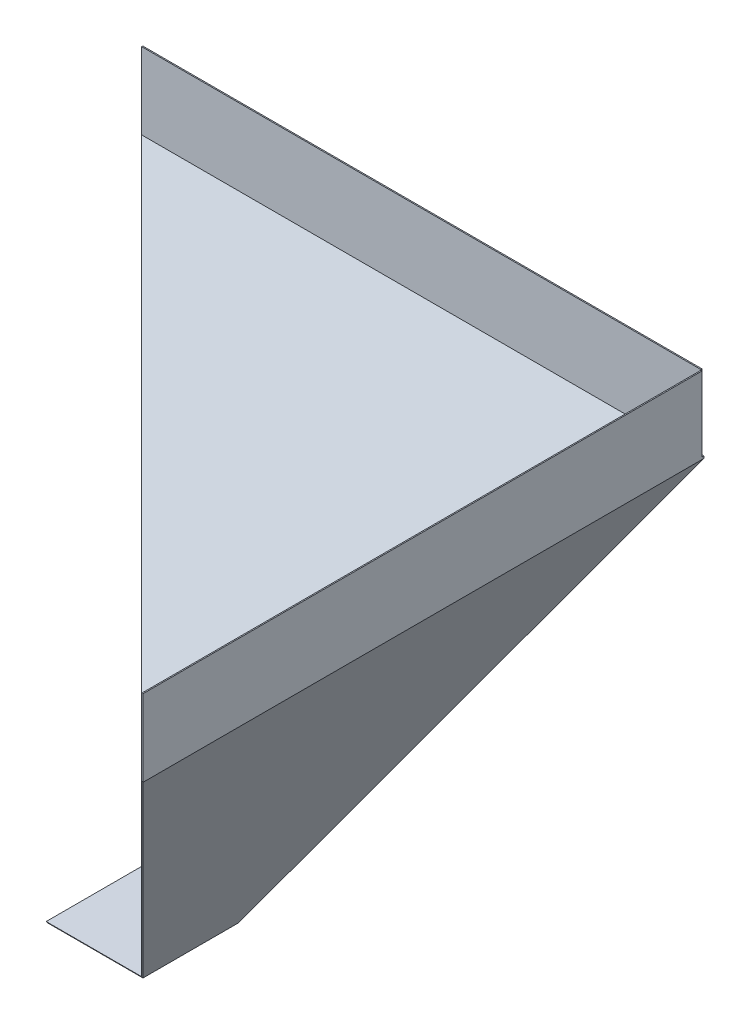
ISO-10303-21;
HEADER;
FILE_DESCRIPTION(('STEP AP214'),'2;1');
FILE_NAME('part.step','',(''),(''),'','','');
FILE_SCHEMA(('AUTOMOTIVE_DESIGN { 1 0 10303 214 1 1 1 1 }'));
ENDSEC;
DATA;
#1=APPLICATION_CONTEXT('core data for automotive mechanical design processes');
#2=APPLICATION_PROTOCOL_DEFINITION('international standard','automotive_design',2000,#1);
#3=PRODUCT_CONTEXT('',#1,'mechanical');
#4=PRODUCT('Part','Part','',(#3));
#5=PRODUCT_RELATED_PRODUCT_CATEGORY('part','',(#4));
#6=PRODUCT_DEFINITION_FORMATION('','',#4);
#7=PRODUCT_DEFINITION_CONTEXT('part definition',#1,'design');
#8=PRODUCT_DEFINITION('design','',#6,#7);
#9=PRODUCT_DEFINITION_SHAPE('','',#8);
#10=(LENGTH_UNIT() NAMED_UNIT(*) SI_UNIT(.MILLI.,.METRE.));
#11=(NAMED_UNIT(*) PLANE_ANGLE_UNIT() SI_UNIT($,.RADIAN.));
#12=(NAMED_UNIT(*) SI_UNIT($,.STERADIAN.) SOLID_ANGLE_UNIT());
#13=UNCERTAINTY_MEASURE_WITH_UNIT(LENGTH_MEASURE(1.E-05),#10,'distance_accuracy_value','');
#14=(GEOMETRIC_REPRESENTATION_CONTEXT(3) GLOBAL_UNCERTAINTY_ASSIGNED_CONTEXT((#13)) GLOBAL_UNIT_ASSIGNED_CONTEXT((#10,
#11,#12)) REPRESENTATION_CONTEXT('',''));
#15=CARTESIAN_POINT('',(0.,0.,0.));
#16=DIRECTION('',(0.,0.,1.));
#17=DIRECTION('',(1.,0.,0.));
#18=AXIS2_PLACEMENT_3D('',#15,#16,#17);
#19=CARTESIAN_POINT('',(293.,80.,-294.2));
#20=DIRECTION('',(0.,0.,1.));
#21=DIRECTION('',(1.,0.,0.));
#22=AXIS2_PLACEMENT_3D('',#19,#20,#21);
#23=PLANE('',#22);
#24=DIRECTION('',(-1.,0.,0.));
#25=VECTOR('',#24,1.);
#26=CARTESIAN_POINT('',(292.292893218813,2.07407407407407,-294.2));
#27=LINE('',#26,#25);
#28=CARTESIAN_POINT('',(294.199999999999,2.0740740740742,-294.2));
#29=VERTEX_POINT('',#28);
#30=CARTESIAN_POINT('',(292.292893218813,2.07407407407407,-294.2));
#31=VERTEX_POINT('',#30);
#32=EDGE_CURVE('E495',#29,#31,#27,.T.);
#33=ORIENTED_EDGE('',*,*,#32,.F.);
#34=DIRECTION('',(0.,-1.,0.));
#35=VECTOR('',#34,1.);
#36=CARTESIAN_POINT('',(294.2,80.,-294.2));
#37=LINE('',#36,#35);
#38=CARTESIAN_POINT('',(294.2,-0.322127767329497,-294.2));
#39=VERTEX_POINT('',#38);
#40=EDGE_CURVE('E188',#29,#39,#37,.T.);
#41=ORIENTED_EDGE('',*,*,#40,.T.);
#42=DIRECTION('',(-1.,0.,0.));
#43=VECTOR('',#42,1.);
#44=CARTESIAN_POINT('',(293.,-0.322127767329566,-294.2));
#45=LINE('',#44,#43);
#46=CARTESIAN_POINT('',(-292.813626077473,-0.322127767329662,-294.2));
#47=VERTEX_POINT('',#46);
#48=EDGE_CURVE('E66',#39,#47,#45,.T.);
#49=ORIENTED_EDGE('',*,*,#48,.T.);
#50=DIRECTION('',(0.50079253728353,-0.865567348391287,0.));
#51=VECTOR('',#50,1.);
#52=CARTESIAN_POINT('',(-219.517602538129,-127.006612897061,-294.2));
#53=LINE('',#52,#51);
#54=CARTESIAN_POINT('',(-293.,0.,-294.2));
#55=VERTEX_POINT('',#54);
#56=EDGE_CURVE('E198',#55,#47,#53,.T.);
#57=ORIENTED_EDGE('',*,*,#56,.F.);
#58=DIRECTION('',(0.,-1.,0.));
#59=VECTOR('',#58,1.);
#60=CARTESIAN_POINT('',(-293.,80.,-294.2));
#61=LINE('',#60,#59);
#62=CARTESIAN_POINT('',(-293.,80.,-294.2));
#63=VERTEX_POINT('',#62);
#64=EDGE_CURVE('E170',#63,#55,#61,.T.);
#65=ORIENTED_EDGE('',*,*,#64,.F.);
#66=DIRECTION('',(-1.,0.,0.));
#67=VECTOR('',#66,1.);
#68=CARTESIAN_POINT('',(293.,80.,-294.2));
#69=LINE('',#68,#67);
#70=CARTESIAN_POINT('',(292.292893218813,80.,-294.2));
#71=VERTEX_POINT('',#70);
#72=EDGE_CURVE('E168',#71,#63,#69,.T.);
#73=ORIENTED_EDGE('',*,*,#72,.F.);
#74=DIRECTION('',(0.,1.,0.));
#75=VECTOR('',#74,1.);
#76=CARTESIAN_POINT('',(292.292893218813,-42.4,-294.2));
#77=LINE('',#76,#75);
#78=EDGE_CURVE('E497',#31,#71,#77,.T.);
#79=ORIENTED_EDGE('',*,*,#78,.F.);
#80=EDGE_LOOP('',(#33,#41,#49,#57,#65,#73,#79));
#81=FACE_BOUND('',#80,.T.);
#82=ADVANCED_FACE('F41',(#81),#23,.F.);
#83=CARTESIAN_POINT('',(0.,80.,0.));
#84=DIRECTION('',(0.,1.,0.));
#85=DIRECTION('',(0.,0.,1.));
#86=AXIS2_PLACEMENT_3D('',#83,#84,#85);
#87=PLANE('',#86);
#88=DIRECTION('',(-1.,0.,0.));
#89=VECTOR('',#88,1.);
#90=CARTESIAN_POINT('',(293.,80.,-293.));
#91=LINE('',#90,#89);
#92=CARTESIAN_POINT('',(292.292893218813,80.,-293.));
#93=VERTEX_POINT('',#92);
#94=CARTESIAN_POINT('',(-293.,80.,-293.));
#95=VERTEX_POINT('',#94);
#96=EDGE_CURVE('E398',#93,#95,#91,.T.);
#97=ORIENTED_EDGE('',*,*,#96,.F.);
#98=DIRECTION('',(0.,0.,-1.));
#99=VECTOR('',#98,1.);
#100=CARTESIAN_POINT('',(292.292893218813,80.,-292.292893218813));
#101=LINE('',#100,#99);
#102=EDGE_CURVE('E58',#93,#71,#101,.T.);
#103=ORIENTED_EDGE('',*,*,#102,.T.);
#104=ORIENTED_EDGE('',*,*,#72,.T.);
#105=DIRECTION('',(0.,0.,1.));
#106=VECTOR('',#105,1.);
#107=CARTESIAN_POINT('',(-293.,80.,293.));
#108=LINE('',#107,#106);
#109=EDGE_CURVE('E172',#63,#95,#108,.T.);
#110=ORIENTED_EDGE('',*,*,#109,.T.);
#111=EDGE_LOOP('',(#97,#103,#104,#110));
#112=FACE_BOUND('',#111,.T.);
#113=ADVANCED_FACE('F234',(#112),#87,.T.);
#114=DIRECTION('',(0.,0.,-1.));
#115=VECTOR('',#114,1.);
#116=CARTESIAN_POINT('',(294.2,80.,293.));
#117=LINE('',#116,#115);
#118=CARTESIAN_POINT('',(294.2,80.,293.));
#119=VERTEX_POINT('',#118);
#120=CARTESIAN_POINT('',(294.2,80.,-292.292893218813));
#121=VERTEX_POINT('',#120);
#122=EDGE_CURVE('E158',#119,#121,#117,.T.);
#123=ORIENTED_EDGE('',*,*,#122,.T.);
#124=DIRECTION('',(-1.,0.,0.));
#125=VECTOR('',#124,1.);
#126=CARTESIAN_POINT('',(294.2,80.,-292.292893218813));
#127=LINE('',#126,#125);
#128=CARTESIAN_POINT('',(293.,80.,-292.292893218813));
#129=VERTEX_POINT('',#128);
#130=EDGE_CURVE('E144',#121,#129,#127,.T.);
#131=ORIENTED_EDGE('',*,*,#130,.T.);
#132=DIRECTION('',(0.,0.,-1.));
#133=VECTOR('',#132,1.);
#134=CARTESIAN_POINT('',(293.,80.,293.));
#135=LINE('',#134,#133);
#136=CARTESIAN_POINT('',(293.,80.,293.));
#137=VERTEX_POINT('',#136);
#138=EDGE_CURVE('E399',#137,#129,#135,.T.);
#139=ORIENTED_EDGE('',*,*,#138,.F.);
#140=DIRECTION('',(1.,0.,0.));
#141=VECTOR('',#140,1.);
#142=CARTESIAN_POINT('',(293.,80.,293.));
#143=LINE('',#142,#141);
#144=EDGE_CURVE('E166',#137,#119,#143,.T.);
#145=ORIENTED_EDGE('',*,*,#144,.T.);
#146=EDGE_LOOP('',(#123,#131,#139,#145));
#147=FACE_BOUND('',#146,.T.);
#148=ADVANCED_FACE('F164',(#147),#87,.T.);
#149=CARTESIAN_POINT('',(293.,80.,293.));
#150=DIRECTION('',(-1.,0.,0.));
#151=DIRECTION('',(0.,0.,1.));
#152=AXIS2_PLACEMENT_3D('',#149,#150,#151);
#153=PLANE('',#152);
#154=ORIENTED_EDGE('',*,*,#138,.T.);
#155=DIRECTION('',(0.,-1.,0.));
#156=VECTOR('',#155,1.);
#157=CARTESIAN_POINT('',(293.,80.,-292.292893218813));
#158=LINE('',#157,#156);
#159=CARTESIAN_POINT('',(293.,0.,-292.292893218813));
#160=VERTEX_POINT('',#159);
#161=EDGE_CURVE('E12',#129,#160,#158,.T.);
#162=ORIENTED_EDGE('',*,*,#161,.T.);
#163=DIRECTION('',(0.,0.,-1.));
#164=VECTOR('',#163,1.);
#165=CARTESIAN_POINT('',(293.,0.,-293.));
#166=LINE('',#165,#164);
#167=CARTESIAN_POINT('',(293.,0.,293.));
#168=VERTEX_POINT('',#167);
#169=EDGE_CURVE('E44',#168,#160,#166,.T.);
#170=ORIENTED_EDGE('',*,*,#169,.F.);
#171=DIRECTION('',(0.,-1.,0.));
#172=VECTOR('',#171,1.);
#173=CARTESIAN_POINT('',(293.,80.,293.));
#174=LINE('',#173,#172);
#175=EDGE_CURVE('E310',#137,#168,#174,.T.);
#176=ORIENTED_EDGE('',*,*,#175,.F.);
#177=EDGE_LOOP('',(#154,#162,#170,#176));
#178=FACE_BOUND('',#177,.T.);
#179=ADVANCED_FACE('F318',(#178),#153,.T.);
#180=CARTESIAN_POINT('',(293.,80.,-293.));
#181=DIRECTION('',(0.,0.,1.));
#182=DIRECTION('',(1.,0.,0.));
#183=AXIS2_PLACEMENT_3D('',#180,#181,#182);
#184=PLANE('',#183);
#185=DIRECTION('',(-1.,0.,0.));
#186=VECTOR('',#185,1.);
#187=CARTESIAN_POINT('',(293.,0.,-293.));
#188=LINE('',#187,#186);
#189=CARTESIAN_POINT('',(292.292893218813,0.,-293.));
#190=VERTEX_POINT('',#189);
#191=CARTESIAN_POINT('',(-293.,0.,-293.));
#192=VERTEX_POINT('',#191);
#193=EDGE_CURVE('E307',#190,#192,#188,.T.);
#194=ORIENTED_EDGE('',*,*,#193,.F.);
#195=DIRECTION('',(0.,1.,0.));
#196=VECTOR('',#195,1.);
#197=CARTESIAN_POINT('',(292.292893218813,80.,-293.));
#198=LINE('',#197,#196);
#199=EDGE_CURVE('E50',#190,#93,#198,.T.);
#200=ORIENTED_EDGE('',*,*,#199,.T.);
#201=ORIENTED_EDGE('',*,*,#96,.T.);
#202=DIRECTION('',(0.,-1.,0.));
#203=VECTOR('',#202,1.);
#204=CARTESIAN_POINT('',(-293.,80.,-293.));
#205=LINE('',#204,#203);
#206=EDGE_CURVE('E287',#95,#192,#205,.T.);
#207=ORIENTED_EDGE('',*,*,#206,.T.);
#208=EDGE_LOOP('',(#194,#200,#201,#207));
#209=FACE_BOUND('',#208,.T.);
#210=ADVANCED_FACE('F328',(#209),#184,.T.);
#211=CARTESIAN_POINT('',(0.,-127.00661289706,219.517602538129));
#212=DIRECTION('',(0.,0.50079253728353,-0.865567348391287));
#213=DIRECTION('',(0.,0.865567348391287,0.50079253728353));
#214=AXIS2_PLACEMENT_3D('',#211,#212,#213);
#215=PLANE('',#214);
#216=DIRECTION('',(0.447780419351412,0.77394146554565,0.447780419351412));
#217=VECTOR('',#216,1.);
#218=CARTESIAN_POINT('',(50.,-420.,49.9999999999999));
#219=LINE('',#218,#217);
#220=CARTESIAN_POINT('',(50.,-420.,49.9999999999999));
#221=VERTEX_POINT('',#220);
#222=EDGE_CURVE('E282',#221,#168,#219,.T.);
#223=ORIENTED_EDGE('',*,*,#222,.F.);
#224=DIRECTION('',(1.,0.,0.));
#225=VECTOR('',#224,1.);
#226=CARTESIAN_POINT('',(-50.,-420.,49.9999999999999));
#227=LINE('',#226,#225);
#228=CARTESIAN_POINT('',(-50.,-420.,49.9999999999999));
#229=VERTEX_POINT('',#228);
#230=EDGE_CURVE('E464',#229,#221,#227,.T.);
#231=ORIENTED_EDGE('',*,*,#230,.F.);
#232=DIRECTION('',(-0.447780419351411,0.77394146554565,0.447780419351412));
#233=VECTOR('',#232,1.);
#234=CARTESIAN_POINT('',(-50.,-420.,49.9999999999999));
#235=LINE('',#234,#233);
#236=CARTESIAN_POINT('',(-49.3057142857143,-421.2,49.3057142857142));
#237=VERTEX_POINT('',#236);
#238=EDGE_CURVE('E180',#237,#229,#235,.T.);
#239=ORIENTED_EDGE('',*,*,#238,.F.);
#240=DIRECTION('',(1.,0.,0.));
#241=VECTOR('',#240,1.);
#242=CARTESIAN_POINT('',(0.,-421.2,49.3057142857141));
#243=LINE('',#242,#241);
#244=CARTESIAN_POINT('',(50.6920882082406,-421.2,49.3057142857141));
#245=VERTEX_POINT('',#244);
#246=EDGE_CURVE('E184',#237,#245,#243,.T.);
#247=ORIENTED_EDGE('',*,*,#246,.T.);
#248=DIRECTION('',(0.447780419351412,0.77394146554565,0.447780419351412));
#249=VECTOR('',#248,1.);
#250=CARTESIAN_POINT('',(176.611115707696,-203.5621746923,175.224741785169));
#251=LINE('',#250,#249);
#252=CARTESIAN_POINT('',(294.2,-0.322127767329622,292.813626077473));
#253=VERTEX_POINT('',#252);
#254=EDGE_CURVE('E175',#245,#253,#251,.T.);
#255=ORIENTED_EDGE('',*,*,#254,.T.);
#256=DIRECTION('',(0.,0.865567348391287,0.50079253728353));
#257=VECTOR('',#256,1.);
#258=CARTESIAN_POINT('',(294.2,-127.00661289706,219.517602538129));
#259=LINE('',#258,#257);
#260=CARTESIAN_POINT('',(294.2,2.91433543964104E-13,293.));
#261=VERTEX_POINT('',#260);
#262=EDGE_CURVE('E195',#253,#261,#259,.T.);
#263=ORIENTED_EDGE('',*,*,#262,.T.);
#264=CARTESIAN_POINT('',(293.,0.,293.));
#265=DIRECTION('',(1.,0.,0.));
#266=VECTOR('',#265,1.);
#267=LINE('',#264,#266);
#268=EDGE_CURVE('E210',#168,#261,#267,.T.);
#269=ORIENTED_EDGE('',*,*,#268,.F.);
#270=EDGE_LOOP('',(#223,#231,#239,#247,#255,#263,#269));
#271=FACE_BOUND('',#270,.T.);
#272=ADVANCED_FACE('F241',(#271),#215,.F.);
#273=CARTESIAN_POINT('',(-293.,80.,293.));
#274=DIRECTION('',(1.,0.,0.));
#275=DIRECTION('',(0.,0.,-1.));
#276=AXIS2_PLACEMENT_3D('',#273,#274,#275);
#277=PLANE('',#276);
#278=ORIENTED_EDGE('',*,*,#206,.F.);
#279=ORIENTED_EDGE('',*,*,#109,.F.);
#280=ORIENTED_EDGE('',*,*,#64,.T.);
#281=CARTESIAN_POINT('',(-293.,0.,-294.2));
#282=DIRECTION('',(0.,0.,1.));
#283=VECTOR('',#282,1.);
#284=LINE('',#281,#283);
#285=EDGE_CURVE('E262',#55,#192,#284,.T.);
#286=ORIENTED_EDGE('',*,*,#285,.T.);
#287=EDGE_LOOP('',(#278,#279,#280,#286));
#288=FACE_BOUND('',#287,.T.);
#289=ADVANCED_FACE('F236',(#288),#277,.F.);
#290=CARTESIAN_POINT('',(0.,-421.2,0.));
#291=DIRECTION('',(0.,1.,0.));
#292=DIRECTION('',(0.,0.,1.));
#293=AXIS2_PLACEMENT_3D('',#290,#291,#292);
#294=PLANE('',#293);
#295=DIRECTION('',(0.,0.,-1.));
#296=VECTOR('',#295,1.);
#297=CARTESIAN_POINT('',(50.6920882082406,-421.2,0.));
#298=LINE('',#297,#296);
#299=CARTESIAN_POINT('',(50.6920882082406,-421.2,-50.6920882082408));
#300=VERTEX_POINT('',#299);
#301=EDGE_CURVE('E187',#245,#300,#298,.T.);
#302=ORIENTED_EDGE('',*,*,#301,.F.);
#303=ORIENTED_EDGE('',*,*,#246,.F.);
#304=DIRECTION('',(0.,0.,1.));
#305=VECTOR('',#304,1.);
#306=CARTESIAN_POINT('',(-49.3057142857143,-421.2,0.));
#307=LINE('',#306,#305);
#308=CARTESIAN_POINT('',(-49.3057142857144,-421.2,-50.6920882082408));
#309=VERTEX_POINT('',#308);
#310=EDGE_CURVE('E181',#309,#237,#307,.T.);
#311=ORIENTED_EDGE('',*,*,#310,.F.);
#312=DIRECTION('',(-1.,0.,0.));
#313=VECTOR('',#312,1.);
#314=CARTESIAN_POINT('',(0.,-421.2,-50.6920882082408));
#315=LINE('',#314,#313);
#316=EDGE_CURVE('E183',#300,#309,#315,.T.);
#317=ORIENTED_EDGE('',*,*,#316,.F.);
#318=EDGE_LOOP('',(#302,#303,#311,#317));
#319=FACE_BOUND('',#318,.T.);
#320=ADVANCED_FACE('F240',(#319),#294,.F.);
#321=CARTESIAN_POINT('',(-219.517602538129,-127.006612897061,0.));
#322=DIRECTION('',(0.865567348391287,0.50079253728353,0.));
#323=DIRECTION('',(-0.50079253728353,0.865567348391287,0.));
#324=AXIS2_PLACEMENT_3D('',#321,#322,#323);
#325=PLANE('',#324);
#326=DIRECTION('',(0.,0.,1.));
#327=VECTOR('',#326,1.);
#328=CARTESIAN_POINT('',(-50.,-420.,-50.0000000000001));
#329=LINE('',#328,#327);
#330=CARTESIAN_POINT('',(-50.,-420.,-50.0000000000001));
#331=VERTEX_POINT('',#330);
#332=EDGE_CURVE('E459',#331,#229,#329,.T.);
#333=ORIENTED_EDGE('',*,*,#332,.F.);
#334=DIRECTION('',(-0.447780419351412,0.77394146554565,-0.447780419351411));
#335=VECTOR('',#334,1.);
#336=CARTESIAN_POINT('',(-50.,-420.,-50.0000000000001));
#337=LINE('',#336,#335);
#338=EDGE_CURVE('E294',#331,#192,#337,.T.);
#339=ORIENTED_EDGE('',*,*,#338,.T.);
#340=ORIENTED_EDGE('',*,*,#285,.F.);
#341=ORIENTED_EDGE('',*,*,#56,.T.);
#342=DIRECTION('',(-0.447780419351412,0.77394146554565,-0.447780419351411));
#343=VECTOR('',#342,1.);
#344=CARTESIAN_POINT('',(-175.224741785169,-203.5621746923,-176.611115707696));
#345=LINE('',#344,#343);
#346=EDGE_CURVE('E178',#309,#47,#345,.T.);
#347=ORIENTED_EDGE('',*,*,#346,.F.);
#348=ORIENTED_EDGE('',*,*,#310,.T.);
#349=ORIENTED_EDGE('',*,*,#238,.T.);
#350=EDGE_LOOP('',(#333,#339,#340,#341,#347,#348,#349));
#351=FACE_BOUND('',#350,.T.);
#352=ADVANCED_FACE('F243',(#351),#325,.F.);
#353=CARTESIAN_POINT('',(0.,-127.607563941801,-220.556283356199));
#354=DIRECTION('',(0.,0.50079253728353,0.865567348391287));
#355=DIRECTION('',(0.,-0.865567348391287,0.50079253728353));
#356=AXIS2_PLACEMENT_3D('',#353,#354,#355);
#357=PLANE('',#356);
#358=ORIENTED_EDGE('',*,*,#346,.T.);
#359=ORIENTED_EDGE('',*,*,#48,.F.);
#360=DIRECTION('',(0.447780419351411,0.77394146554565,-0.447780419351411));
#361=VECTOR('',#360,1.);
#362=CARTESIAN_POINT('',(176.333137610217,-204.042630663251,-176.333137610217));
#363=LINE('',#362,#361);
#364=EDGE_CURVE('E259',#300,#39,#363,.T.);
#365=ORIENTED_EDGE('',*,*,#364,.F.);
#366=ORIENTED_EDGE('',*,*,#316,.T.);
#367=EDGE_LOOP('',(#358,#359,#365,#366));
#368=FACE_BOUND('',#367,.T.);
#369=ADVANCED_FACE('F280',(#368),#357,.F.);
#370=CARTESIAN_POINT('',(220.556283356199,-127.607563941801,0.));
#371=DIRECTION('',(-0.865567348391287,0.50079253728353,0.));
#372=DIRECTION('',(-0.50079253728353,-0.865567348391287,0.));
#373=AXIS2_PLACEMENT_3D('',#370,#371,#372);
#374=PLANE('',#373);
#375=ORIENTED_EDGE('',*,*,#364,.T.);
#376=DIRECTION('',(0.,0.,-1.));
#377=VECTOR('',#376,1.);
#378=CARTESIAN_POINT('',(294.2,-0.322127767329525,293.));
#379=LINE('',#378,#377);
#380=EDGE_CURVE('E258',#253,#39,#379,.T.);
#381=ORIENTED_EDGE('',*,*,#380,.F.);
#382=ORIENTED_EDGE('',*,*,#254,.F.);
#383=ORIENTED_EDGE('',*,*,#301,.T.);
#384=EDGE_LOOP('',(#375,#381,#382,#383));
#385=FACE_BOUND('',#384,.T.);
#386=ADVANCED_FACE('F233',(#385),#374,.F.);
#387=CARTESIAN_POINT('',(293.,80.,293.));
#388=DIRECTION('',(0.,0.,-1.));
#389=DIRECTION('',(-1.,0.,0.));
#390=AXIS2_PLACEMENT_3D('',#387,#388,#389);
#391=PLANE('',#390);
#392=ORIENTED_EDGE('',*,*,#144,.F.);
#393=ORIENTED_EDGE('',*,*,#175,.T.);
#394=ORIENTED_EDGE('',*,*,#268,.T.);
#395=DIRECTION('',(0.,-1.,0.));
#396=VECTOR('',#395,1.);
#397=CARTESIAN_POINT('',(294.2,80.,293.));
#398=LINE('',#397,#396);
#399=EDGE_CURVE('E185',#119,#261,#398,.T.);
#400=ORIENTED_EDGE('',*,*,#399,.F.);
#401=EDGE_LOOP('',(#392,#393,#394,#400));
#402=FACE_BOUND('',#401,.T.);
#403=ADVANCED_FACE('F223',(#402),#391,.F.);
#404=CARTESIAN_POINT('',(294.2,80.,293.));
#405=DIRECTION('',(-1.,0.,0.));
#406=DIRECTION('',(0.,0.,1.));
#407=AXIS2_PLACEMENT_3D('',#404,#405,#406);
#408=PLANE('',#407);
#409=DIRECTION('',(0.,0.,-1.));
#410=VECTOR('',#409,1.);
#411=CARTESIAN_POINT('',(294.2,2.07407407407412,-294.2));
#412=LINE('',#411,#410);
#413=CARTESIAN_POINT('',(294.2,2.07407407407406,-292.292893218813));
#414=VERTEX_POINT('',#413);
#415=EDGE_CURVE('E161',#414,#29,#412,.T.);
#416=ORIENTED_EDGE('',*,*,#415,.F.);
#417=DIRECTION('',(0.,1.,0.));
#418=VECTOR('',#417,1.);
#419=CARTESIAN_POINT('',(294.2,-42.4,-292.292893218813));
#420=LINE('',#419,#418);
#421=EDGE_CURVE('E147',#414,#121,#420,.T.);
#422=ORIENTED_EDGE('',*,*,#421,.T.);
#423=ORIENTED_EDGE('',*,*,#122,.F.);
#424=ORIENTED_EDGE('',*,*,#399,.T.);
#425=ORIENTED_EDGE('',*,*,#262,.F.);
#426=ORIENTED_EDGE('',*,*,#380,.T.);
#427=ORIENTED_EDGE('',*,*,#40,.F.);
#428=EDGE_LOOP('',(#416,#422,#423,#424,#425,#426,#427));
#429=FACE_BOUND('',#428,.T.);
#430=ADVANCED_FACE('F156',(#429),#408,.F.);
#431=CARTESIAN_POINT('',(0.,-420.,0.));
#432=DIRECTION('',(0.,1.,0.));
#433=DIRECTION('',(0.,0.,1.));
#434=AXIS2_PLACEMENT_3D('',#431,#432,#433);
#435=PLANE('',#434);
#436=DIRECTION('',(0.,0.,-1.));
#437=VECTOR('',#436,1.);
#438=CARTESIAN_POINT('',(50.,-420.,-50.0000000000001));
#439=LINE('',#438,#437);
#440=CARTESIAN_POINT('',(50.,-420.,-50.0000000000001));
#441=VERTEX_POINT('',#440);
#442=EDGE_CURVE('E312',#221,#441,#439,.T.);
#443=ORIENTED_EDGE('',*,*,#442,.T.);
#444=DIRECTION('',(-1.,0.,0.));
#445=VECTOR('',#444,1.);
#446=CARTESIAN_POINT('',(-50.,-420.,-50.0000000000001));
#447=LINE('',#446,#445);
#448=EDGE_CURVE('E407',#441,#331,#447,.T.);
#449=ORIENTED_EDGE('',*,*,#448,.T.);
#450=ORIENTED_EDGE('',*,*,#332,.T.);
#451=ORIENTED_EDGE('',*,*,#230,.T.);
#452=EDGE_LOOP('',(#443,#449,#450,#451));
#453=FACE_BOUND('',#452,.T.);
#454=ADVANCED_FACE('F332',(#453),#435,.T.);
#455=CARTESIAN_POINT('',(0.,-127.00661289706,-219.517602538129));
#456=DIRECTION('',(0.,0.50079253728353,0.865567348391287));
#457=DIRECTION('',(0.,-0.865567348391287,0.50079253728353));
#458=AXIS2_PLACEMENT_3D('',#455,#456,#457);
#459=PLANE('',#458);
#460=DIRECTION('',(0.,-0.865567348391287,0.50079253728353));
#461=VECTOR('',#460,1.);
#462=CARTESIAN_POINT('',(292.292893218813,-32.0728791291868,-274.443548503828));
#463=LINE('',#462,#461);
#464=EDGE_CURVE('E500',#31,#190,#463,.T.);
#465=ORIENTED_EDGE('',*,*,#464,.T.);
#466=ORIENTED_EDGE('',*,*,#193,.T.);
#467=ORIENTED_EDGE('',*,*,#338,.F.);
#468=ORIENTED_EDGE('',*,*,#448,.F.);
#469=DIRECTION('',(0.447780419351411,0.77394146554565,-0.447780419351411));
#470=VECTOR('',#469,1.);
#471=CARTESIAN_POINT('',(50.,-420.,-50.0000000000001));
#472=LINE('',#471,#470);
#473=EDGE_CURVE('E411',#441,#29,#472,.T.);
#474=ORIENTED_EDGE('',*,*,#473,.T.);
#475=ORIENTED_EDGE('',*,*,#32,.T.);
#476=EDGE_LOOP('',(#465,#466,#467,#468,#474,#475));
#477=FACE_BOUND('',#476,.T.);
#478=ADVANCED_FACE('F336',(#477),#459,.T.);
#479=CARTESIAN_POINT('',(219.517602538129,-127.00661289706,0.));
#480=DIRECTION('',(-0.865567348391287,0.50079253728353,0.));
#481=DIRECTION('',(-0.50079253728353,-0.865567348391287,0.));
#482=AXIS2_PLACEMENT_3D('',#479,#480,#481);
#483=PLANE('',#482);
#484=ORIENTED_EDGE('',*,*,#415,.T.);
#485=ORIENTED_EDGE('',*,*,#473,.F.);
#486=ORIENTED_EDGE('',*,*,#442,.F.);
#487=ORIENTED_EDGE('',*,*,#222,.T.);
#488=ORIENTED_EDGE('',*,*,#169,.T.);
#489=DIRECTION('',(0.50079253728353,0.865567348391287,0.));
#490=VECTOR('',#489,1.);
#491=CARTESIAN_POINT('',(274.921837850235,-31.2462061847788,-292.292893218813));
#492=LINE('',#491,#490);
#493=EDGE_CURVE('E162',#160,#414,#492,.T.);
#494=ORIENTED_EDGE('',*,*,#493,.T.);
#495=EDGE_LOOP('',(#484,#485,#486,#487,#488,#494));
#496=FACE_BOUND('',#495,.T.);
#497=ADVANCED_FACE('F433',(#496),#483,.T.);
#498=CARTESIAN_POINT('',(292.292893218813,-42.4,-292.292893218813));
#499=DIRECTION('',(1.,0.,0.));
#500=DIRECTION('',(0.,0.,-1.));
#501=AXIS2_PLACEMENT_3D('',#498,#499,#500);
#502=PLANE('',#501);
#503=ORIENTED_EDGE('',*,*,#464,.F.);
#504=ORIENTED_EDGE('',*,*,#78,.T.);
#505=ORIENTED_EDGE('',*,*,#102,.F.);
#506=ORIENTED_EDGE('',*,*,#199,.F.);
#507=EDGE_LOOP('',(#503,#504,#505,#506));
#508=FACE_BOUND('',#507,.T.);
#509=ADVANCED_FACE('F441',(#508),#502,.T.);
#510=CARTESIAN_POINT('',(294.2,-42.4,-292.292893218813));
#511=DIRECTION('',(0.,0.,-1.));
#512=DIRECTION('',(-1.,0.,0.));
#513=AXIS2_PLACEMENT_3D('',#510,#511,#512);
#514=PLANE('',#513);
#515=ORIENTED_EDGE('',*,*,#130,.F.);
#516=ORIENTED_EDGE('',*,*,#421,.F.);
#517=ORIENTED_EDGE('',*,*,#493,.F.);
#518=ORIENTED_EDGE('',*,*,#161,.F.);
#519=EDGE_LOOP('',(#515,#516,#517,#518));
#520=FACE_BOUND('',#519,.T.);
#521=ADVANCED_FACE('F146',(#520),#514,.T.);
#522=CLOSED_SHELL('',(#82,#113,#148,#179,#210,#272,#289,#320,#352,#369,#386,#403,#430,#454,#478,
#497,#509,#521));
#523=MANIFOLD_SOLID_BREP('B2',#522);
#524=ADVANCED_BREP_SHAPE_REPRESENTATION('',(#18,#523),#14);
#525=SHAPE_DEFINITION_REPRESENTATION(#9,#524);
ENDSEC;
END-ISO-10303-21;
